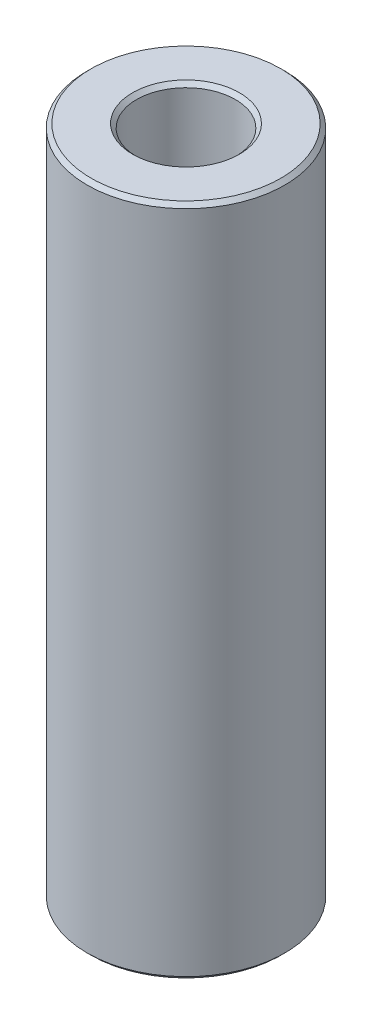
ISO-10303-21;
HEADER;
FILE_DESCRIPTION(('STEP AP214'),'2;1');
FILE_NAME('part.step','',(''),(''),'','','');
FILE_SCHEMA(('AUTOMOTIVE_DESIGN { 1 0 10303 214 1 1 1 1 }'));
ENDSEC;
DATA;
#1=APPLICATION_CONTEXT('core data for automotive mechanical design processes');
#2=APPLICATION_PROTOCOL_DEFINITION('international standard','automotive_design',2000,#1);
#3=PRODUCT_CONTEXT('',#1,'mechanical');
#4=PRODUCT('Part','Part','',(#3));
#5=PRODUCT_RELATED_PRODUCT_CATEGORY('part','',(#4));
#6=PRODUCT_DEFINITION_FORMATION('','',#4);
#7=PRODUCT_DEFINITION_CONTEXT('part definition',#1,'design');
#8=PRODUCT_DEFINITION('design','',#6,#7);
#9=PRODUCT_DEFINITION_SHAPE('','',#8);
#10=(LENGTH_UNIT() NAMED_UNIT(*) SI_UNIT(.MILLI.,.METRE.));
#11=(NAMED_UNIT(*) PLANE_ANGLE_UNIT() SI_UNIT($,.RADIAN.));
#12=(NAMED_UNIT(*) SI_UNIT($,.STERADIAN.) SOLID_ANGLE_UNIT());
#13=UNCERTAINTY_MEASURE_WITH_UNIT(LENGTH_MEASURE(1.E-05),#10,'distance_accuracy_value','');
#14=(GEOMETRIC_REPRESENTATION_CONTEXT(3) GLOBAL_UNCERTAINTY_ASSIGNED_CONTEXT((#13)) GLOBAL_UNIT_ASSIGNED_CONTEXT((#10,
#11,#12)) REPRESENTATION_CONTEXT('',''));
#15=CARTESIAN_POINT('',(0.,0.,0.));
#16=DIRECTION('',(0.,0.,1.));
#17=DIRECTION('',(1.,0.,0.));
#18=AXIS2_PLACEMENT_3D('',#15,#16,#17);
#19=CARTESIAN_POINT('',(-7.74542595019659,43.2308,7.63785058977719));
#20=DIRECTION('',(0.,1.,0.));
#21=DIRECTION('',(0.,0.,1.));
#22=AXIS2_PLACEMENT_3D('',#19,#20,#21);
#23=CYLINDRICAL_SURFACE('',#22,3.175);
#24=CARTESIAN_POINT('',(-7.74542595019659,0.254000000040833,7.63785058977719));
#25=DIRECTION('',(0.,-1.,0.));
#26=DIRECTION('',(0.,0.,-1.));
#27=AXIS2_PLACEMENT_3D('',#24,#25,#26);
#28=CIRCLE('',#27,3.17499999998818);
#29=CARTESIAN_POINT('',(-7.74542595019659,0.254000000040833,4.46285058978901));
#30=VERTEX_POINT('',#29);
#31=EDGE_CURVE('E34',#30,#30,#28,.T.);
#32=ORIENTED_EDGE('',*,*,#31,.T.);
#33=EDGE_LOOP('',(#32));
#34=FACE_BOUND('',#33,.T.);
#35=CARTESIAN_POINT('',(-7.74542595019659,42.9767999999626,7.63785058977719));
#36=DIRECTION('',(0.,1.,0.));
#37=DIRECTION('',(0.,0.,1.));
#38=AXIS2_PLACEMENT_3D('',#35,#36,#37);
#39=CIRCLE('',#38,3.17500000000946);
#40=CARTESIAN_POINT('',(-7.74542595019659,42.9767999999626,10.8128505897866));
#41=VERTEX_POINT('',#40);
#42=EDGE_CURVE('E37',#41,#41,#39,.T.);
#43=ORIENTED_EDGE('',*,*,#42,.T.);
#44=EDGE_LOOP('',(#43));
#45=FACE_BOUND('',#44,.T.);
#46=ADVANCED_FACE('F15',(#34,#45),#23,.F.);
#47=CARTESIAN_POINT('',(-7.74542595019659,43.2307999998898,7.63785058977719));
#48=DIRECTION('',(0.,1.,0.));
#49=DIRECTION('',(0.,0.,1.));
#50=AXIS2_PLACEMENT_3D('',#47,#48,#49);
#51=CONICAL_SURFACE('',#50,3.4289999999366,0.785398163397448);
#52=ORIENTED_EDGE('',*,*,#42,.F.);
#53=EDGE_LOOP('',(#52));
#54=FACE_BOUND('',#53,.T.);
#55=CARTESIAN_POINT('',(-7.74542595019659,43.2307999999466,7.63785058977719));
#56=DIRECTION('',(0.,1.,0.));
#57=DIRECTION('',(0.,0.,1.));
#58=AXIS2_PLACEMENT_3D('',#55,#56,#57);
#59=CIRCLE('',#58,3.42899999999345);
#60=CARTESIAN_POINT('',(-7.74542595019659,43.2307999999466,11.0668505897706));
#61=VERTEX_POINT('',#60);
#62=EDGE_CURVE('E18',#61,#61,#59,.F.);
#63=ORIENTED_EDGE('',*,*,#62,.F.);
#64=EDGE_LOOP('',(#63));
#65=FACE_BOUND('',#64,.T.);
#66=ADVANCED_FACE('F58',(#54,#65),#51,.F.);
#67=CARTESIAN_POINT('',(-7.74542595019659,1.13686837721616E-10,7.63785058977719));
#68=DIRECTION('',(0.,-1.,0.));
#69=DIRECTION('',(0.,0.,-1.));
#70=AXIS2_PLACEMENT_3D('',#67,#68,#69);
#71=CONICAL_SURFACE('',#70,3.42899999991532,0.785398163397448);
#72=CARTESIAN_POINT('',(-7.74542595019659,5.6843418860808E-11,7.63785058977719));
#73=DIRECTION('',(0.,-1.,0.));
#74=DIRECTION('',(0.,0.,-1.));
#75=AXIS2_PLACEMENT_3D('',#72,#73,#74);
#76=CIRCLE('',#75,3.42899999997217);
#77=CARTESIAN_POINT('',(-7.74542595019659,5.6843418860808E-11,4.20885058980502));
#78=VERTEX_POINT('',#77);
#79=EDGE_CURVE('E48',#78,#78,#76,.T.);
#80=ORIENTED_EDGE('',*,*,#79,.T.);
#81=EDGE_LOOP('',(#80));
#82=FACE_BOUND('',#81,.T.);
#83=ORIENTED_EDGE('',*,*,#31,.F.);
#84=EDGE_LOOP('',(#83));
#85=FACE_BOUND('',#84,.T.);
#86=ADVANCED_FACE('F60',(#82,#85),#71,.F.);
#87=CARTESIAN_POINT('',(-7.74542595019659,43.2308,7.63785058977719));
#88=DIRECTION('',(0.,1.,0.));
#89=DIRECTION('',(0.,0.,1.));
#90=AXIS2_PLACEMENT_3D('',#87,#88,#89);
#91=PLANE('',#90);
#92=ORIENTED_EDGE('',*,*,#62,.T.);
#93=EDGE_LOOP('',(#92));
#94=FACE_BOUND('',#93,.T.);
#95=CARTESIAN_POINT('',(-7.74542595019659,43.2307999999466,7.63785058977719));
#96=DIRECTION('',(0.,-1.,0.));
#97=DIRECTION('',(0.,0.,-1.));
#98=AXIS2_PLACEMENT_3D('',#95,#96,#97);
#99=CIRCLE('',#98,6.09600000000301);
#100=CARTESIAN_POINT('',(-7.74542595019659,43.2307999999466,1.54185058977419));
#101=VERTEX_POINT('',#100);
#102=EDGE_CURVE('E46',#101,#101,#99,.T.);
#103=ORIENTED_EDGE('',*,*,#102,.F.);
#104=EDGE_LOOP('',(#103));
#105=FACE_BOUND('',#104,.T.);
#106=ADVANCED_FACE('F55',(#94,#105),#91,.T.);
#107=CARTESIAN_POINT('',(-7.74542595019659,0.,7.63785058977719));
#108=DIRECTION('',(0.,1.,0.));
#109=DIRECTION('',(0.,0.,1.));
#110=AXIS2_PLACEMENT_3D('',#107,#108,#109);
#111=PLANE('',#110);
#112=ORIENTED_EDGE('',*,*,#79,.F.);
#113=EDGE_LOOP('',(#112));
#114=FACE_BOUND('',#113,.T.);
#115=CARTESIAN_POINT('',(-7.74542595019659,0.,7.63785058977719));
#116=DIRECTION('',(0.,1.,0.));
#117=DIRECTION('',(0.,0.,1.));
#118=AXIS2_PLACEMENT_3D('',#115,#116,#117);
#119=CIRCLE('',#118,6.09599999996744);
#120=CARTESIAN_POINT('',(-7.74542595019659,0.,13.7338505897446));
#121=VERTEX_POINT('',#120);
#122=EDGE_CURVE('E27',#121,#121,#119,.T.);
#123=ORIENTED_EDGE('',*,*,#122,.F.);
#124=EDGE_LOOP('',(#123));
#125=FACE_BOUND('',#124,.T.);
#126=ADVANCED_FACE('F84',(#114,#125),#111,.F.);
#127=CARTESIAN_POINT('',(-7.74542595019659,42.9767999999626,7.63785058977719));
#128=DIRECTION('',(0.,-1.,0.));
#129=DIRECTION('',(0.,0.,-1.));
#130=AXIS2_PLACEMENT_3D('',#127,#128,#129);
#131=CONICAL_SURFACE('',#130,6.34999999998699,0.785398163397448);
#132=ORIENTED_EDGE('',*,*,#102,.T.);
#133=EDGE_LOOP('',(#132));
#134=FACE_BOUND('',#133,.T.);
#135=CARTESIAN_POINT('',(-7.74542595019659,42.9768,7.63785058977719));
#136=DIRECTION('',(0.,1.,0.));
#137=DIRECTION('',(0.,0.,1.));
#138=AXIS2_PLACEMENT_3D('',#135,#136,#137);
#139=CIRCLE('',#138,6.35);
#140=CARTESIAN_POINT('',(-7.74542595019659,42.9768,13.9878505897772));
#141=VERTEX_POINT('',#140);
#142=EDGE_CURVE('E22',#141,#141,#139,.F.);
#143=ORIENTED_EDGE('',*,*,#142,.F.);
#144=EDGE_LOOP('',(#143));
#145=FACE_BOUND('',#144,.T.);
#146=ADVANCED_FACE('F77',(#134,#145),#131,.T.);
#147=CARTESIAN_POINT('',(-7.74542595019659,0.254000000097676,7.63785058977719));
#148=DIRECTION('',(0.,1.,0.));
#149=DIRECTION('',(0.,0.,1.));
#150=AXIS2_PLACEMENT_3D('',#147,#148,#149);
#151=CONICAL_SURFACE('',#150,6.35000000006512,0.785398163397448);
#152=CARTESIAN_POINT('',(-7.74542595019659,0.253999999999997,7.63785058977719));
#153=DIRECTION('',(0.,1.,0.));
#154=DIRECTION('',(0.,0.,1.));
#155=AXIS2_PLACEMENT_3D('',#152,#153,#154);
#156=CIRCLE('',#155,6.35);
#157=CARTESIAN_POINT('',(-7.74542595019659,0.253999999999997,13.9878505897772));
#158=VERTEX_POINT('',#157);
#159=EDGE_CURVE('E10',#158,#158,#156,.T.);
#160=ORIENTED_EDGE('',*,*,#159,.F.);
#161=EDGE_LOOP('',(#160));
#162=FACE_BOUND('',#161,.T.);
#163=ORIENTED_EDGE('',*,*,#122,.T.);
#164=EDGE_LOOP('',(#163));
#165=FACE_BOUND('',#164,.T.);
#166=ADVANCED_FACE('F72',(#162,#165),#151,.T.);
#167=CARTESIAN_POINT('',(-7.74542595019659,43.2308,7.63785058977719));
#168=DIRECTION('',(0.,1.,0.));
#169=DIRECTION('',(0.,0.,1.));
#170=AXIS2_PLACEMENT_3D('',#167,#168,#169);
#171=CYLINDRICAL_SURFACE('',#170,6.35);
#172=ORIENTED_EDGE('',*,*,#159,.T.);
#173=EDGE_LOOP('',(#172));
#174=FACE_BOUND('',#173,.T.);
#175=ORIENTED_EDGE('',*,*,#142,.T.);
#176=EDGE_LOOP('',(#175));
#177=FACE_BOUND('',#176,.T.);
#178=ADVANCED_FACE('F70',(#174,#177),#171,.T.);
#179=CLOSED_SHELL('',(#46,#66,#86,#106,#126,#146,#166,#178));
#180=MANIFOLD_SOLID_BREP('B1',#179);
#181=ADVANCED_BREP_SHAPE_REPRESENTATION('',(#18,#180),#14);
#182=SHAPE_DEFINITION_REPRESENTATION(#9,#181);
ENDSEC;
END-ISO-10303-21;
